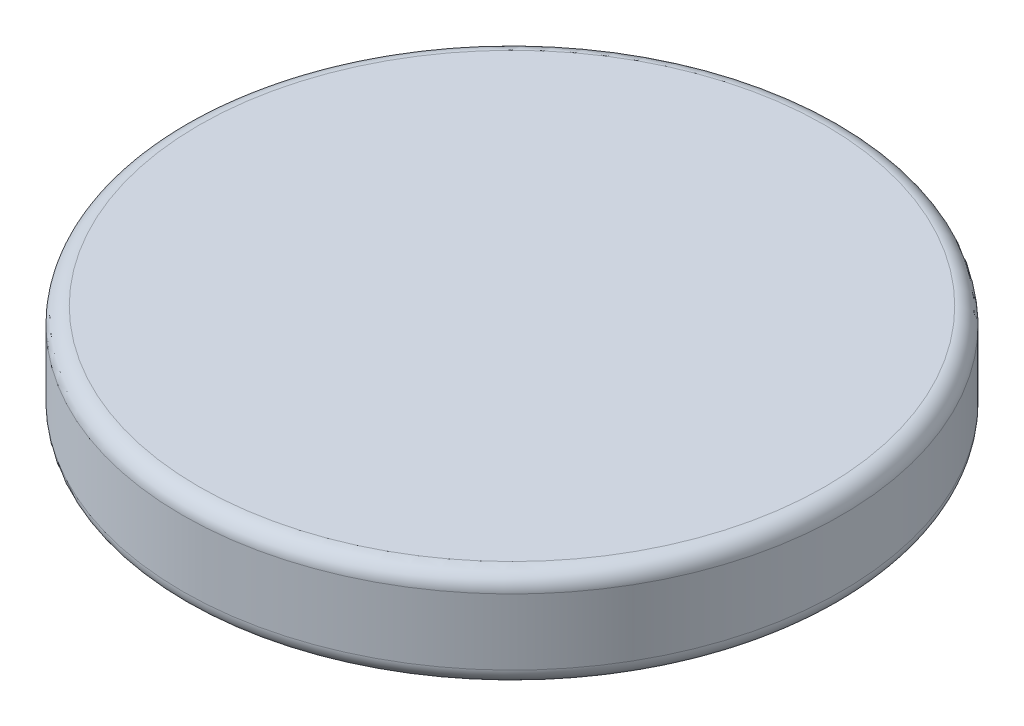
ISO-10303-21;
HEADER;
FILE_DESCRIPTION(('STEP AP214'),'2;1');
FILE_NAME('part.step','',(''),(''),'','','');
FILE_SCHEMA(('AUTOMOTIVE_DESIGN { 1 0 10303 214 1 1 1 1 }'));
ENDSEC;
DATA;
#1=APPLICATION_CONTEXT('core data for automotive mechanical design processes');
#2=APPLICATION_PROTOCOL_DEFINITION('international standard','automotive_design',2000,#1);
#3=PRODUCT_CONTEXT('',#1,'mechanical');
#4=PRODUCT('Part','Part','',(#3));
#5=PRODUCT_RELATED_PRODUCT_CATEGORY('part','',(#4));
#6=PRODUCT_DEFINITION_FORMATION('','',#4);
#7=PRODUCT_DEFINITION_CONTEXT('part definition',#1,'design');
#8=PRODUCT_DEFINITION('design','',#6,#7);
#9=PRODUCT_DEFINITION_SHAPE('','',#8);
#10=(LENGTH_UNIT() NAMED_UNIT(*) SI_UNIT(.MILLI.,.METRE.));
#11=(NAMED_UNIT(*) PLANE_ANGLE_UNIT() SI_UNIT($,.RADIAN.));
#12=(NAMED_UNIT(*) SI_UNIT($,.STERADIAN.) SOLID_ANGLE_UNIT());
#13=UNCERTAINTY_MEASURE_WITH_UNIT(LENGTH_MEASURE(1.E-05),#10,'distance_accuracy_value','');
#14=(GEOMETRIC_REPRESENTATION_CONTEXT(3) GLOBAL_UNCERTAINTY_ASSIGNED_CONTEXT((#13)) GLOBAL_UNIT_ASSIGNED_CONTEXT((#10,
#11,#12)) REPRESENTATION_CONTEXT('',''));
#15=CARTESIAN_POINT('',(0.,0.,0.));
#16=DIRECTION('',(0.,0.,1.));
#17=DIRECTION('',(1.,0.,0.));
#18=AXIS2_PLACEMENT_3D('',#15,#16,#17);
#19=CARTESIAN_POINT('',(0.,1.5,0.));
#20=DIRECTION('',(0.,-1.,0.));
#21=DIRECTION('',(0.,0.,-1.));
#22=AXIS2_PLACEMENT_3D('',#19,#20,#21);
#23=CYLINDRICAL_SURFACE('',#22,10.);
#24=CARTESIAN_POINT('',(0.,-1.,0.));
#25=DIRECTION('',(0.,1.,0.));
#26=DIRECTION('',(0.,0.,1.));
#27=AXIS2_PLACEMENT_3D('',#24,#25,#26);
#28=CIRCLE('',#27,10.);
#29=CARTESIAN_POINT('',(0.,-1.,10.));
#30=VERTEX_POINT('',#29);
#31=EDGE_CURVE('E42',#30,#30,#28,.T.);
#32=ORIENTED_EDGE('',*,*,#31,.T.);
#33=EDGE_LOOP('',(#32));
#34=FACE_BOUND('',#33,.T.);
#35=CARTESIAN_POINT('',(0.,1.,0.));
#36=DIRECTION('',(0.,1.,0.));
#37=DIRECTION('',(0.,0.,1.));
#38=AXIS2_PLACEMENT_3D('',#35,#36,#37);
#39=CIRCLE('',#38,10.);
#40=CARTESIAN_POINT('',(0.,1.,10.));
#41=VERTEX_POINT('',#40);
#42=EDGE_CURVE('E46',#41,#41,#39,.F.);
#43=ORIENTED_EDGE('',*,*,#42,.T.);
#44=EDGE_LOOP('',(#43));
#45=FACE_BOUND('',#44,.T.);
#46=ADVANCED_FACE('F31',(#34,#45),#23,.T.);
#47=CARTESIAN_POINT('',(0.,1.5,0.));
#48=DIRECTION('',(0.,1.,0.));
#49=DIRECTION('',(0.,0.,1.));
#50=AXIS2_PLACEMENT_3D('',#47,#48,#49);
#51=PLANE('',#50);
#52=CARTESIAN_POINT('',(0.,1.5,0.));
#53=DIRECTION('',(0.,1.,0.));
#54=DIRECTION('',(0.,0.,1.));
#55=AXIS2_PLACEMENT_3D('',#52,#53,#54);
#56=CIRCLE('',#55,9.5);
#57=CARTESIAN_POINT('',(0.,1.5,9.5));
#58=VERTEX_POINT('',#57);
#59=EDGE_CURVE('E10',#58,#58,#56,.T.);
#60=ORIENTED_EDGE('',*,*,#59,.T.);
#61=EDGE_LOOP('',(#60));
#62=FACE_BOUND('',#61,.T.);
#63=ADVANCED_FACE('F62',(#62),#51,.T.);
#64=CARTESIAN_POINT('',(0.,-1.5,0.));
#65=DIRECTION('',(0.,1.,0.));
#66=DIRECTION('',(0.,0.,1.));
#67=AXIS2_PLACEMENT_3D('',#64,#65,#66);
#68=PLANE('',#67);
#69=CARTESIAN_POINT('',(0.,-1.5,0.));
#70=DIRECTION('',(0.,1.,0.));
#71=DIRECTION('',(0.,0.,1.));
#72=AXIS2_PLACEMENT_3D('',#69,#70,#71);
#73=CIRCLE('',#72,9.5);
#74=CARTESIAN_POINT('',(0.,-1.5,9.5));
#75=VERTEX_POINT('',#74);
#76=EDGE_CURVE('E38',#75,#75,#73,.F.);
#77=ORIENTED_EDGE('',*,*,#76,.T.);
#78=EDGE_LOOP('',(#77));
#79=FACE_BOUND('',#78,.T.);
#80=ADVANCED_FACE('F59',(#79),#68,.F.);
#81=CARTESIAN_POINT('',(0.,-1.,0.));
#82=DIRECTION('',(0.,1.,0.));
#83=DIRECTION('',(0.,0.,1.));
#84=AXIS2_PLACEMENT_3D('',#81,#82,#83);
#85=TOROIDAL_SURFACE('',#84,9.5,0.5);
#86=ORIENTED_EDGE('',*,*,#76,.F.);
#87=EDGE_LOOP('',(#86));
#88=FACE_BOUND('',#87,.T.);
#89=ORIENTED_EDGE('',*,*,#31,.F.);
#90=EDGE_LOOP('',(#89));
#91=FACE_BOUND('',#90,.T.);
#92=ADVANCED_FACE('F55',(#88,#91),#85,.T.);
#93=CARTESIAN_POINT('',(0.,1.,0.));
#94=DIRECTION('',(0.,1.,0.));
#95=DIRECTION('',(0.,0.,1.));
#96=AXIS2_PLACEMENT_3D('',#93,#94,#95);
#97=TOROIDAL_SURFACE('',#96,9.5,0.5);
#98=ORIENTED_EDGE('',*,*,#42,.F.);
#99=EDGE_LOOP('',(#98));
#100=FACE_BOUND('',#99,.T.);
#101=ORIENTED_EDGE('',*,*,#59,.F.);
#102=EDGE_LOOP('',(#101));
#103=FACE_BOUND('',#102,.T.);
#104=ADVANCED_FACE('F33',(#100,#103),#97,.T.);
#105=CLOSED_SHELL('',(#46,#63,#80,#92,#104));
#106=MANIFOLD_SOLID_BREP('B2',#105);
#107=ADVANCED_BREP_SHAPE_REPRESENTATION('',(#18,#106),#14);
#108=SHAPE_DEFINITION_REPRESENTATION(#9,#107);
ENDSEC;
END-ISO-10303-21;
